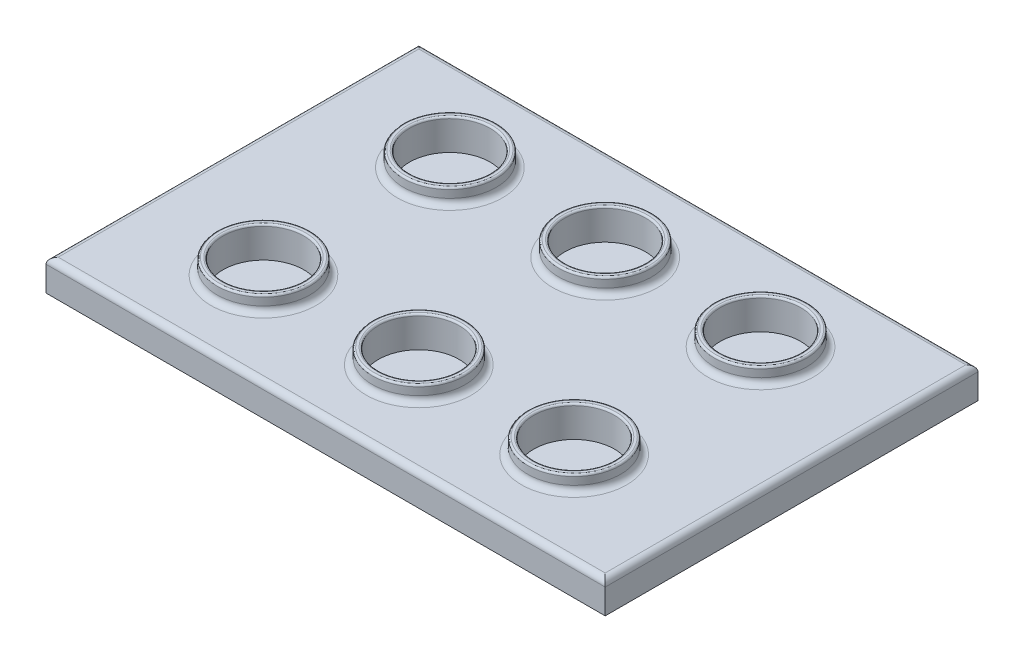
ISO-10303-21;
HEADER;
FILE_DESCRIPTION(('STEP AP214'),'2;1');
FILE_NAME('part.step','',(''),(''),'','','');
FILE_SCHEMA(('AUTOMOTIVE_DESIGN { 1 0 10303 214 1 1 1 1 }'));
ENDSEC;
DATA;
#1=APPLICATION_CONTEXT('core data for automotive mechanical design processes');
#2=APPLICATION_PROTOCOL_DEFINITION('international standard','automotive_design',2000,#1);
#3=PRODUCT_CONTEXT('',#1,'mechanical');
#4=PRODUCT('Part','Part','',(#3));
#5=PRODUCT_RELATED_PRODUCT_CATEGORY('part','',(#4));
#6=PRODUCT_DEFINITION_FORMATION('','',#4);
#7=PRODUCT_DEFINITION_CONTEXT('part definition',#1,'design');
#8=PRODUCT_DEFINITION('design','',#6,#7);
#9=PRODUCT_DEFINITION_SHAPE('','',#8);
#10=(LENGTH_UNIT() NAMED_UNIT(*) SI_UNIT(.MILLI.,.METRE.));
#11=(NAMED_UNIT(*) PLANE_ANGLE_UNIT() SI_UNIT($,.RADIAN.));
#12=(NAMED_UNIT(*) SI_UNIT($,.STERADIAN.) SOLID_ANGLE_UNIT());
#13=UNCERTAINTY_MEASURE_WITH_UNIT(LENGTH_MEASURE(1.E-05),#10,'distance_accuracy_value','');
#14=(GEOMETRIC_REPRESENTATION_CONTEXT(3) GLOBAL_UNCERTAINTY_ASSIGNED_CONTEXT((#13)) GLOBAL_UNIT_ASSIGNED_CONTEXT((#10,
#11,#12)) REPRESENTATION_CONTEXT('',''));
#15=CARTESIAN_POINT('',(0.,0.,0.));
#16=DIRECTION('',(0.,0.,1.));
#17=DIRECTION('',(1.,0.,0.));
#18=AXIS2_PLACEMENT_3D('',#15,#16,#17);
#19=CARTESIAN_POINT('',(0.,12.7,0.));
#20=DIRECTION('',(0.,-1.,0.));
#21=DIRECTION('',(0.,0.,-1.));
#22=AXIS2_PLACEMENT_3D('',#19,#20,#21);
#23=PLANE('',#22);
#24=CARTESIAN_POINT('',(-63.4999999999999,12.7,38.1));
#25=DIRECTION('',(0.,-1.,0.));
#26=DIRECTION('',(0.,0.,-1.));
#27=AXIS2_PLACEMENT_3D('',#24,#25,#26);
#28=CIRCLE('',#27,21.51);
#29=CARTESIAN_POINT('',(-63.4999999999999,12.7,16.59));
#30=VERTEX_POINT('',#29);
#31=EDGE_CURVE('E277',#30,#30,#28,.T.);
#32=ORIENTED_EDGE('',*,*,#31,.T.);
#33=EDGE_LOOP('',(#32));
#34=FACE_BOUND('',#33,.T.);
#35=CARTESIAN_POINT('',(63.5000000000001,12.7,38.1));
#36=DIRECTION('',(0.,-1.,0.));
#37=DIRECTION('',(0.,0.,-1.));
#38=AXIS2_PLACEMENT_3D('',#35,#36,#37);
#39=CIRCLE('',#38,21.51);
#40=CARTESIAN_POINT('',(63.5000000000001,12.7,16.59));
#41=VERTEX_POINT('',#40);
#42=EDGE_CURVE('E273',#41,#41,#39,.T.);
#43=ORIENTED_EDGE('',*,*,#42,.T.);
#44=EDGE_LOOP('',(#43));
#45=FACE_BOUND('',#44,.T.);
#46=CARTESIAN_POINT('',(0.,12.7,-38.1));
#47=DIRECTION('',(0.,-1.,0.));
#48=DIRECTION('',(0.,0.,-1.));
#49=AXIS2_PLACEMENT_3D('',#46,#47,#48);
#50=CIRCLE('',#49,21.51);
#51=CARTESIAN_POINT('',(0.,12.7,-59.61));
#52=VERTEX_POINT('',#51);
#53=EDGE_CURVE('E269',#52,#52,#50,.T.);
#54=ORIENTED_EDGE('',*,*,#53,.T.);
#55=EDGE_LOOP('',(#54));
#56=FACE_BOUND('',#55,.T.);
#57=DIRECTION('',(0.,0.,1.));
#58=VECTOR('',#57,1.);
#59=CARTESIAN_POINT('',(-111.8,12.7,0.));
#60=LINE('',#59,#58);
#61=CARTESIAN_POINT('',(-111.8,12.7,-73.7));
#62=VERTEX_POINT('',#61);
#63=CARTESIAN_POINT('',(-111.8,12.7,73.7));
#64=VERTEX_POINT('',#63);
#65=EDGE_CURVE('E262',#62,#64,#60,.T.);
#66=ORIENTED_EDGE('',*,*,#65,.T.);
#67=DIRECTION('',(1.,0.,0.));
#68=VECTOR('',#67,1.);
#69=CARTESIAN_POINT('',(0.,12.7,73.7));
#70=LINE('',#69,#68);
#71=CARTESIAN_POINT('',(111.8,12.7,73.7));
#72=VERTEX_POINT('',#71);
#73=EDGE_CURVE('E265',#64,#72,#70,.T.);
#74=ORIENTED_EDGE('',*,*,#73,.T.);
#75=DIRECTION('',(0.,0.,-1.));
#76=VECTOR('',#75,1.);
#77=CARTESIAN_POINT('',(111.8,12.7,0.));
#78=LINE('',#77,#76);
#79=CARTESIAN_POINT('',(111.8,12.7,-73.7));
#80=VERTEX_POINT('',#79);
#81=EDGE_CURVE('E256',#72,#80,#78,.T.);
#82=ORIENTED_EDGE('',*,*,#81,.T.);
#83=DIRECTION('',(-1.,0.,0.));
#84=VECTOR('',#83,1.);
#85=CARTESIAN_POINT('',(0.,12.7,-73.7));
#86=LINE('',#85,#84);
#87=EDGE_CURVE('E259',#80,#62,#86,.T.);
#88=ORIENTED_EDGE('',*,*,#87,.T.);
#89=EDGE_LOOP('',(#66,#74,#82,#88));
#90=FACE_BOUND('',#89,.T.);
#91=CARTESIAN_POINT('',(-63.4999999999999,12.7,-38.1));
#92=DIRECTION('',(0.,-1.,0.));
#93=DIRECTION('',(0.,0.,-1.));
#94=AXIS2_PLACEMENT_3D('',#91,#92,#93);
#95=CIRCLE('',#94,21.51);
#96=CARTESIAN_POINT('',(-63.4999999999999,12.7,-59.61));
#97=VERTEX_POINT('',#96);
#98=EDGE_CURVE('E252',#97,#97,#95,.T.);
#99=ORIENTED_EDGE('',*,*,#98,.T.);
#100=EDGE_LOOP('',(#99));
#101=FACE_BOUND('',#100,.T.);
#102=CARTESIAN_POINT('',(63.5000000000001,12.7,-38.1));
#103=DIRECTION('',(0.,-1.,0.));
#104=DIRECTION('',(0.,0.,-1.));
#105=AXIS2_PLACEMENT_3D('',#102,#103,#104);
#106=CIRCLE('',#105,21.51);
#107=CARTESIAN_POINT('',(63.5000000000001,12.7,-59.61));
#108=VERTEX_POINT('',#107);
#109=EDGE_CURVE('E248',#108,#108,#106,.T.);
#110=ORIENTED_EDGE('',*,*,#109,.T.);
#111=EDGE_LOOP('',(#110));
#112=FACE_BOUND('',#111,.T.);
#113=CARTESIAN_POINT('',(0.,12.7,38.1));
#114=DIRECTION('',(0.,-1.,0.));
#115=DIRECTION('',(0.,0.,-1.));
#116=AXIS2_PLACEMENT_3D('',#113,#114,#115);
#117=CIRCLE('',#116,21.51);
#118=CARTESIAN_POINT('',(0.,12.7,16.59));
#119=VERTEX_POINT('',#118);
#120=EDGE_CURVE('E244',#119,#119,#117,.T.);
#121=ORIENTED_EDGE('',*,*,#120,.T.);
#122=EDGE_LOOP('',(#121));
#123=FACE_BOUND('',#122,.T.);
#124=ADVANCED_FACE('F44',(#34,#45,#56,#90,#101,#112,#123),#23,.F.);
#125=CARTESIAN_POINT('',(114.3,12.7,76.2));
#126=DIRECTION('',(-1.,0.,0.));
#127=DIRECTION('',(0.,0.,1.));
#128=AXIS2_PLACEMENT_3D('',#125,#126,#127);
#129=PLANE('',#128);
#130=DIRECTION('',(0.,-1.,0.));
#131=VECTOR('',#130,1.);
#132=CARTESIAN_POINT('',(114.3,12.7,-76.2));
#133=LINE('',#132,#131);
#134=CARTESIAN_POINT('',(114.3,10.2,-76.2));
#135=VERTEX_POINT('',#134);
#136=CARTESIAN_POINT('',(114.3,0.,-76.2));
#137=VERTEX_POINT('',#136);
#138=EDGE_CURVE('E99',#135,#137,#133,.T.);
#139=ORIENTED_EDGE('',*,*,#138,.F.);
#140=DIRECTION('',(0.,0.,-1.));
#141=VECTOR('',#140,1.);
#142=CARTESIAN_POINT('',(114.3,10.2,76.2));
#143=LINE('',#142,#141);
#144=CARTESIAN_POINT('',(114.3,10.2,76.2));
#145=VERTEX_POINT('',#144);
#146=EDGE_CURVE('E297',#135,#145,#143,.F.);
#147=ORIENTED_EDGE('',*,*,#146,.T.);
#148=DIRECTION('',(0.,-1.,0.));
#149=VECTOR('',#148,1.);
#150=CARTESIAN_POINT('',(114.3,12.7,76.2));
#151=LINE('',#150,#149);
#152=CARTESIAN_POINT('',(114.3,0.,76.2));
#153=VERTEX_POINT('',#152);
#154=EDGE_CURVE('E122',#145,#153,#151,.T.);
#155=ORIENTED_EDGE('',*,*,#154,.T.);
#156=DIRECTION('',(0.,0.,-1.));
#157=VECTOR('',#156,1.);
#158=CARTESIAN_POINT('',(114.3,0.,76.2));
#159=LINE('',#158,#157);
#160=EDGE_CURVE('E115',#153,#137,#159,.T.);
#161=ORIENTED_EDGE('',*,*,#160,.T.);
#162=EDGE_LOOP('',(#139,#147,#155,#161));
#163=FACE_BOUND('',#162,.T.);
#164=ADVANCED_FACE('F120',(#163),#129,.F.);
#165=CARTESIAN_POINT('',(-114.3,12.7,-76.2));
#166=DIRECTION('',(0.,0.,1.));
#167=DIRECTION('',(1.,0.,0.));
#168=AXIS2_PLACEMENT_3D('',#165,#166,#167);
#169=PLANE('',#168);
#170=DIRECTION('',(0.,-1.,0.));
#171=VECTOR('',#170,1.);
#172=CARTESIAN_POINT('',(-114.3,12.7,-76.2));
#173=LINE('',#172,#171);
#174=CARTESIAN_POINT('',(-114.3,10.2,-76.2));
#175=VERTEX_POINT('',#174);
#176=CARTESIAN_POINT('',(-114.3,0.,-76.2));
#177=VERTEX_POINT('',#176);
#178=EDGE_CURVE('E109',#175,#177,#173,.T.);
#179=ORIENTED_EDGE('',*,*,#178,.F.);
#180=DIRECTION('',(-1.,0.,0.));
#181=VECTOR('',#180,1.);
#182=CARTESIAN_POINT('',(-114.3,10.2,-76.2));
#183=LINE('',#182,#181);
#184=EDGE_CURVE('E62',#175,#135,#183,.F.);
#185=ORIENTED_EDGE('',*,*,#184,.T.);
#186=ORIENTED_EDGE('',*,*,#138,.T.);
#187=DIRECTION('',(-1.,0.,0.));
#188=VECTOR('',#187,1.);
#189=CARTESIAN_POINT('',(-114.3,0.,-76.2));
#190=LINE('',#189,#188);
#191=EDGE_CURVE('E102',#137,#177,#190,.T.);
#192=ORIENTED_EDGE('',*,*,#191,.T.);
#193=EDGE_LOOP('',(#179,#185,#186,#192));
#194=FACE_BOUND('',#193,.T.);
#195=ADVANCED_FACE('F101',(#194),#169,.F.);
#196=CARTESIAN_POINT('',(-114.3,12.7,76.2));
#197=DIRECTION('',(1.,0.,0.));
#198=DIRECTION('',(0.,0.,-1.));
#199=AXIS2_PLACEMENT_3D('',#196,#197,#198);
#200=PLANE('',#199);
#201=DIRECTION('',(0.,-1.,0.));
#202=VECTOR('',#201,1.);
#203=CARTESIAN_POINT('',(-114.3,12.7,76.2));
#204=LINE('',#203,#202);
#205=CARTESIAN_POINT('',(-114.3,10.2,76.2));
#206=VERTEX_POINT('',#205);
#207=CARTESIAN_POINT('',(-114.3,0.,76.2));
#208=VERTEX_POINT('',#207);
#209=EDGE_CURVE('E140',#206,#208,#204,.T.);
#210=ORIENTED_EDGE('',*,*,#209,.F.);
#211=DIRECTION('',(0.,0.,1.));
#212=VECTOR('',#211,1.);
#213=CARTESIAN_POINT('',(-114.3,10.2,76.2));
#214=LINE('',#213,#212);
#215=EDGE_CURVE('E70',#206,#175,#214,.F.);
#216=ORIENTED_EDGE('',*,*,#215,.T.);
#217=ORIENTED_EDGE('',*,*,#178,.T.);
#218=DIRECTION('',(0.,0.,1.));
#219=VECTOR('',#218,1.);
#220=CARTESIAN_POINT('',(-114.3,0.,76.2));
#221=LINE('',#220,#219);
#222=EDGE_CURVE('E117',#177,#208,#221,.T.);
#223=ORIENTED_EDGE('',*,*,#222,.T.);
#224=EDGE_LOOP('',(#210,#216,#217,#223));
#225=FACE_BOUND('',#224,.T.);
#226=ADVANCED_FACE('F381',(#225),#200,.F.);
#227=CARTESIAN_POINT('',(-114.3,12.7,76.2));
#228=DIRECTION('',(0.,0.,-1.));
#229=DIRECTION('',(-1.,0.,0.));
#230=AXIS2_PLACEMENT_3D('',#227,#228,#229);
#231=PLANE('',#230);
#232=ORIENTED_EDGE('',*,*,#154,.F.);
#233=DIRECTION('',(1.,0.,0.));
#234=VECTOR('',#233,1.);
#235=CARTESIAN_POINT('',(-114.3,10.2,76.2));
#236=LINE('',#235,#234);
#237=EDGE_CURVE('E289',#145,#206,#236,.F.);
#238=ORIENTED_EDGE('',*,*,#237,.T.);
#239=ORIENTED_EDGE('',*,*,#209,.T.);
#240=DIRECTION('',(1.,0.,0.));
#241=VECTOR('',#240,1.);
#242=CARTESIAN_POINT('',(-114.3,0.,76.2));
#243=LINE('',#242,#241);
#244=EDGE_CURVE('E135',#208,#153,#243,.T.);
#245=ORIENTED_EDGE('',*,*,#244,.T.);
#246=EDGE_LOOP('',(#232,#238,#239,#245));
#247=FACE_BOUND('',#246,.T.);
#248=ADVANCED_FACE('F378',(#247),#231,.F.);
#249=CARTESIAN_POINT('',(0.,0.,0.));
#250=DIRECTION('',(0.,-1.,0.));
#251=DIRECTION('',(0.,0.,-1.));
#252=AXIS2_PLACEMENT_3D('',#249,#250,#251);
#253=PLANE('',#252);
#254=ORIENTED_EDGE('',*,*,#160,.F.);
#255=ORIENTED_EDGE('',*,*,#244,.F.);
#256=ORIENTED_EDGE('',*,*,#222,.F.);
#257=ORIENTED_EDGE('',*,*,#191,.F.);
#258=EDGE_LOOP('',(#254,#255,#256,#257));
#259=FACE_BOUND('',#258,.T.);
#260=ADVANCED_FACE('F113',(#259),#253,.T.);
#261=CARTESIAN_POINT('',(-63.4999999999999,19.05,-38.1));
#262=DIRECTION('',(0.,1.,0.));
#263=DIRECTION('',(0.,0.,1.));
#264=AXIS2_PLACEMENT_3D('',#261,#262,#263);
#265=PLANE('',#264);
#266=CARTESIAN_POINT('',(-63.4999999999999,19.05,-38.1));
#267=DIRECTION('',(0.,1.,0.));
#268=DIRECTION('',(0.,0.,1.));
#269=AXIS2_PLACEMENT_3D('',#266,#267,#268);
#270=CIRCLE('',#269,17.26);
#271=CARTESIAN_POINT('',(-63.4999999999999,19.05,-20.84));
#272=VERTEX_POINT('',#271);
#273=EDGE_CURVE('E152',#272,#272,#270,.F.);
#274=ORIENTED_EDGE('',*,*,#273,.T.);
#275=EDGE_LOOP('',(#274));
#276=FACE_BOUND('',#275,.T.);
#277=CARTESIAN_POINT('',(-63.4999999999999,19.05,-38.1));
#278=DIRECTION('',(0.,1.,0.));
#279=DIRECTION('',(0.,0.,1.));
#280=AXIS2_PLACEMENT_3D('',#277,#278,#279);
#281=CIRCLE('',#280,18.26);
#282=CARTESIAN_POINT('',(-63.4999999999999,19.05,-19.84));
#283=VERTEX_POINT('',#282);
#284=EDGE_CURVE('E148',#283,#283,#281,.T.);
#285=ORIENTED_EDGE('',*,*,#284,.T.);
#286=EDGE_LOOP('',(#285));
#287=FACE_BOUND('',#286,.T.);
#288=ADVANCED_FACE('F377',(#276,#287),#265,.T.);
#289=CARTESIAN_POINT('',(-63.4999999999999,19.05,-38.1));
#290=DIRECTION('',(0.,-1.,0.));
#291=DIRECTION('',(0.,0.,-1.));
#292=AXIS2_PLACEMENT_3D('',#289,#290,#291);
#293=CYLINDRICAL_SURFACE('',#292,19.01);
#294=CARTESIAN_POINT('',(-63.4999999999999,15.2,-38.1));
#295=DIRECTION('',(0.,-1.,0.));
#296=DIRECTION('',(0.,0.,-1.));
#297=AXIS2_PLACEMENT_3D('',#294,#295,#296);
#298=CIRCLE('',#297,19.01);
#299=CARTESIAN_POINT('',(-63.4999999999999,15.2,-57.11));
#300=VERTEX_POINT('',#299);
#301=EDGE_CURVE('E300',#300,#300,#298,.F.);
#302=ORIENTED_EDGE('',*,*,#301,.T.);
#303=EDGE_LOOP('',(#302));
#304=FACE_BOUND('',#303,.T.);
#305=CARTESIAN_POINT('',(-63.4999999999999,18.3,-38.1));
#306=DIRECTION('',(0.,1.,0.));
#307=DIRECTION('',(0.,0.,1.));
#308=AXIS2_PLACEMENT_3D('',#305,#306,#307);
#309=CIRCLE('',#308,19.01);
#310=CARTESIAN_POINT('',(-63.4999999999999,18.3,-19.09));
#311=VERTEX_POINT('',#310);
#312=EDGE_CURVE('E156',#311,#311,#309,.F.);
#313=ORIENTED_EDGE('',*,*,#312,.T.);
#314=EDGE_LOOP('',(#313));
#315=FACE_BOUND('',#314,.T.);
#316=ADVANCED_FACE('F485',(#304,#315),#293,.T.);
#317=CARTESIAN_POINT('',(63.5000000000001,19.05,-38.1));
#318=DIRECTION('',(0.,1.,0.));
#319=DIRECTION('',(0.,0.,1.));
#320=AXIS2_PLACEMENT_3D('',#317,#318,#319);
#321=PLANE('',#320);
#322=CARTESIAN_POINT('',(63.5000000000001,19.05,-38.1));
#323=DIRECTION('',(0.,1.,0.));
#324=DIRECTION('',(0.,0.,1.));
#325=AXIS2_PLACEMENT_3D('',#322,#323,#324);
#326=CIRCLE('',#325,17.26);
#327=CARTESIAN_POINT('',(63.5000000000001,19.05,-20.84));
#328=VERTEX_POINT('',#327);
#329=EDGE_CURVE('E184',#328,#328,#326,.F.);
#330=ORIENTED_EDGE('',*,*,#329,.T.);
#331=EDGE_LOOP('',(#330));
#332=FACE_BOUND('',#331,.T.);
#333=CARTESIAN_POINT('',(63.5000000000001,19.05,-38.1));
#334=DIRECTION('',(0.,1.,0.));
#335=DIRECTION('',(0.,0.,1.));
#336=AXIS2_PLACEMENT_3D('',#333,#334,#335);
#337=CIRCLE('',#336,18.26);
#338=CARTESIAN_POINT('',(63.5000000000001,19.05,-19.84));
#339=VERTEX_POINT('',#338);
#340=EDGE_CURVE('E180',#339,#339,#337,.T.);
#341=ORIENTED_EDGE('',*,*,#340,.T.);
#342=EDGE_LOOP('',(#341));
#343=FACE_BOUND('',#342,.T.);
#344=ADVANCED_FACE('F478',(#332,#343),#321,.T.);
#345=CARTESIAN_POINT('',(63.5000000000001,19.05,-38.1));
#346=DIRECTION('',(0.,-1.,0.));
#347=DIRECTION('',(0.,0.,-1.));
#348=AXIS2_PLACEMENT_3D('',#345,#346,#347);
#349=CYLINDRICAL_SURFACE('',#348,19.01);
#350=CARTESIAN_POINT('',(63.5000000000001,15.2,-38.1));
#351=DIRECTION('',(0.,-1.,0.));
#352=DIRECTION('',(0.,0.,-1.));
#353=AXIS2_PLACEMENT_3D('',#350,#351,#352);
#354=CIRCLE('',#353,19.01);
#355=CARTESIAN_POINT('',(63.5000000000001,15.2,-57.11));
#356=VERTEX_POINT('',#355);
#357=EDGE_CURVE('E54',#356,#356,#354,.F.);
#358=ORIENTED_EDGE('',*,*,#357,.T.);
#359=EDGE_LOOP('',(#358));
#360=FACE_BOUND('',#359,.T.);
#361=CARTESIAN_POINT('',(63.5000000000001,18.3,-38.1));
#362=DIRECTION('',(0.,1.,0.));
#363=DIRECTION('',(0.,0.,1.));
#364=AXIS2_PLACEMENT_3D('',#361,#362,#363);
#365=CIRCLE('',#364,19.01);
#366=CARTESIAN_POINT('',(63.5000000000001,18.3,-19.09));
#367=VERTEX_POINT('',#366);
#368=EDGE_CURVE('E188',#367,#367,#365,.F.);
#369=ORIENTED_EDGE('',*,*,#368,.T.);
#370=EDGE_LOOP('',(#369));
#371=FACE_BOUND('',#370,.T.);
#372=ADVANCED_FACE('F474',(#360,#371),#349,.T.);
#373=CARTESIAN_POINT('',(0.,19.05,-38.1));
#374=DIRECTION('',(0.,1.,0.));
#375=DIRECTION('',(0.,0.,1.));
#376=AXIS2_PLACEMENT_3D('',#373,#374,#375);
#377=PLANE('',#376);
#378=CARTESIAN_POINT('',(0.,19.05,-38.1));
#379=DIRECTION('',(0.,1.,0.));
#380=DIRECTION('',(0.,0.,1.));
#381=AXIS2_PLACEMENT_3D('',#378,#379,#380);
#382=CIRCLE('',#381,17.26);
#383=CARTESIAN_POINT('',(0.,19.05,-20.84));
#384=VERTEX_POINT('',#383);
#385=EDGE_CURVE('E168',#384,#384,#382,.F.);
#386=ORIENTED_EDGE('',*,*,#385,.T.);
#387=EDGE_LOOP('',(#386));
#388=FACE_BOUND('',#387,.T.);
#389=CARTESIAN_POINT('',(0.,19.05,-38.1));
#390=DIRECTION('',(0.,1.,0.));
#391=DIRECTION('',(0.,0.,1.));
#392=AXIS2_PLACEMENT_3D('',#389,#390,#391);
#393=CIRCLE('',#392,18.26);
#394=CARTESIAN_POINT('',(0.,19.05,-19.84));
#395=VERTEX_POINT('',#394);
#396=EDGE_CURVE('E164',#395,#395,#393,.T.);
#397=ORIENTED_EDGE('',*,*,#396,.T.);
#398=EDGE_LOOP('',(#397));
#399=FACE_BOUND('',#398,.T.);
#400=ADVANCED_FACE('F477',(#388,#399),#377,.T.);
#401=CARTESIAN_POINT('',(0.,19.05,-38.1));
#402=DIRECTION('',(0.,-1.,0.));
#403=DIRECTION('',(0.,0.,-1.));
#404=AXIS2_PLACEMENT_3D('',#401,#402,#403);
#405=CYLINDRICAL_SURFACE('',#404,19.01);
#406=CARTESIAN_POINT('',(0.,15.2,-38.1));
#407=DIRECTION('',(0.,-1.,0.));
#408=DIRECTION('',(0.,0.,-1.));
#409=AXIS2_PLACEMENT_3D('',#406,#407,#408);
#410=CIRCLE('',#409,19.01);
#411=CARTESIAN_POINT('',(0.,15.2,-57.11));
#412=VERTEX_POINT('',#411);
#413=EDGE_CURVE('E285',#412,#412,#410,.F.);
#414=ORIENTED_EDGE('',*,*,#413,.T.);
#415=EDGE_LOOP('',(#414));
#416=FACE_BOUND('',#415,.T.);
#417=CARTESIAN_POINT('',(0.,18.3,-38.1));
#418=DIRECTION('',(0.,1.,0.));
#419=DIRECTION('',(0.,0.,1.));
#420=AXIS2_PLACEMENT_3D('',#417,#418,#419);
#421=CIRCLE('',#420,19.01);
#422=CARTESIAN_POINT('',(0.,18.3,-19.09));
#423=VERTEX_POINT('',#422);
#424=EDGE_CURVE('E172',#423,#423,#421,.F.);
#425=ORIENTED_EDGE('',*,*,#424,.T.);
#426=EDGE_LOOP('',(#425));
#427=FACE_BOUND('',#426,.T.);
#428=ADVANCED_FACE('F504',(#416,#427),#405,.T.);
#429=CARTESIAN_POINT('',(63.5000000000001,19.05,38.1));
#430=DIRECTION('',(0.,1.,0.));
#431=DIRECTION('',(0.,0.,1.));
#432=AXIS2_PLACEMENT_3D('',#429,#430,#431);
#433=PLANE('',#432);
#434=CARTESIAN_POINT('',(63.5000000000001,19.05,38.1));
#435=DIRECTION('',(0.,1.,0.));
#436=DIRECTION('',(0.,0.,1.));
#437=AXIS2_PLACEMENT_3D('',#434,#435,#436);
#438=CIRCLE('',#437,17.26);
#439=CARTESIAN_POINT('',(63.5000000000001,19.05,55.36));
#440=VERTEX_POINT('',#439);
#441=EDGE_CURVE('E200',#440,#440,#438,.F.);
#442=ORIENTED_EDGE('',*,*,#441,.T.);
#443=EDGE_LOOP('',(#442));
#444=FACE_BOUND('',#443,.T.);
#445=CARTESIAN_POINT('',(63.5000000000001,19.05,38.1));
#446=DIRECTION('',(0.,1.,0.));
#447=DIRECTION('',(0.,0.,1.));
#448=AXIS2_PLACEMENT_3D('',#445,#446,#447);
#449=CIRCLE('',#448,18.26);
#450=CARTESIAN_POINT('',(63.5000000000001,19.05,56.36));
#451=VERTEX_POINT('',#450);
#452=EDGE_CURVE('E196',#451,#451,#449,.T.);
#453=ORIENTED_EDGE('',*,*,#452,.T.);
#454=EDGE_LOOP('',(#453));
#455=FACE_BOUND('',#454,.T.);
#456=ADVANCED_FACE('F500',(#444,#455),#433,.T.);
#457=CARTESIAN_POINT('',(63.5000000000001,19.05,38.1));
#458=DIRECTION('',(0.,-1.,0.));
#459=DIRECTION('',(0.,0.,-1.));
#460=AXIS2_PLACEMENT_3D('',#457,#458,#459);
#461=CYLINDRICAL_SURFACE('',#460,19.01);
#462=CARTESIAN_POINT('',(63.5000000000001,15.2,38.1));
#463=DIRECTION('',(0.,-1.,0.));
#464=DIRECTION('',(0.,0.,-1.));
#465=AXIS2_PLACEMENT_3D('',#462,#463,#464);
#466=CIRCLE('',#465,19.01);
#467=CARTESIAN_POINT('',(63.5000000000001,15.2,19.09));
#468=VERTEX_POINT('',#467);
#469=EDGE_CURVE('E281',#468,#468,#466,.F.);
#470=ORIENTED_EDGE('',*,*,#469,.T.);
#471=EDGE_LOOP('',(#470));
#472=FACE_BOUND('',#471,.T.);
#473=CARTESIAN_POINT('',(63.5000000000001,18.3,38.1));
#474=DIRECTION('',(0.,1.,0.));
#475=DIRECTION('',(0.,0.,1.));
#476=AXIS2_PLACEMENT_3D('',#473,#474,#475);
#477=CIRCLE('',#476,19.01);
#478=CARTESIAN_POINT('',(63.5000000000001,18.3,57.11));
#479=VERTEX_POINT('',#478);
#480=EDGE_CURVE('E204',#479,#479,#477,.F.);
#481=ORIENTED_EDGE('',*,*,#480,.T.);
#482=EDGE_LOOP('',(#481));
#483=FACE_BOUND('',#482,.T.);
#484=ADVANCED_FACE('F496',(#472,#483),#461,.T.);
#485=CARTESIAN_POINT('',(0.,19.05,38.1));
#486=DIRECTION('',(0.,1.,0.));
#487=DIRECTION('',(0.,0.,1.));
#488=AXIS2_PLACEMENT_3D('',#485,#486,#487);
#489=PLANE('',#488);
#490=CARTESIAN_POINT('',(0.,19.05,38.1));
#491=DIRECTION('',(0.,1.,0.));
#492=DIRECTION('',(0.,0.,1.));
#493=AXIS2_PLACEMENT_3D('',#490,#491,#492);
#494=CIRCLE('',#493,17.26);
#495=CARTESIAN_POINT('',(0.,19.05,55.36));
#496=VERTEX_POINT('',#495);
#497=EDGE_CURVE('E216',#496,#496,#494,.F.);
#498=ORIENTED_EDGE('',*,*,#497,.T.);
#499=EDGE_LOOP('',(#498));
#500=FACE_BOUND('',#499,.T.);
#501=CARTESIAN_POINT('',(0.,19.05,38.1));
#502=DIRECTION('',(0.,1.,0.));
#503=DIRECTION('',(0.,0.,1.));
#504=AXIS2_PLACEMENT_3D('',#501,#502,#503);
#505=CIRCLE('',#504,18.26);
#506=CARTESIAN_POINT('',(0.,19.05,56.36));
#507=VERTEX_POINT('',#506);
#508=EDGE_CURVE('E212',#507,#507,#505,.T.);
#509=ORIENTED_EDGE('',*,*,#508,.T.);
#510=EDGE_LOOP('',(#509));
#511=FACE_BOUND('',#510,.T.);
#512=ADVANCED_FACE('F499',(#500,#511),#489,.T.);
#513=CARTESIAN_POINT('',(0.,19.05,38.1));
#514=DIRECTION('',(0.,-1.,0.));
#515=DIRECTION('',(0.,0.,-1.));
#516=AXIS2_PLACEMENT_3D('',#513,#514,#515);
#517=CYLINDRICAL_SURFACE('',#516,19.01);
#518=CARTESIAN_POINT('',(0.,15.2,38.1));
#519=DIRECTION('',(0.,-1.,0.));
#520=DIRECTION('',(0.,0.,-1.));
#521=AXIS2_PLACEMENT_3D('',#518,#519,#520);
#522=CIRCLE('',#521,19.01);
#523=CARTESIAN_POINT('',(0.,15.2,19.09));
#524=VERTEX_POINT('',#523);
#525=EDGE_CURVE('E11',#524,#524,#522,.F.);
#526=ORIENTED_EDGE('',*,*,#525,.T.);
#527=EDGE_LOOP('',(#526));
#528=FACE_BOUND('',#527,.T.);
#529=CARTESIAN_POINT('',(0.,18.3,38.1));
#530=DIRECTION('',(0.,1.,0.));
#531=DIRECTION('',(0.,0.,1.));
#532=AXIS2_PLACEMENT_3D('',#529,#530,#531);
#533=CIRCLE('',#532,19.01);
#534=CARTESIAN_POINT('',(0.,18.3,57.11));
#535=VERTEX_POINT('',#534);
#536=EDGE_CURVE('E220',#535,#535,#533,.F.);
#537=ORIENTED_EDGE('',*,*,#536,.T.);
#538=EDGE_LOOP('',(#537));
#539=FACE_BOUND('',#538,.T.);
#540=ADVANCED_FACE('F506',(#528,#539),#517,.T.);
#541=CARTESIAN_POINT('',(-63.4999999999999,19.05,38.1));
#542=DIRECTION('',(0.,1.,0.));
#543=DIRECTION('',(0.,0.,1.));
#544=AXIS2_PLACEMENT_3D('',#541,#542,#543);
#545=PLANE('',#544);
#546=CARTESIAN_POINT('',(-63.4999999999999,19.05,38.1));
#547=DIRECTION('',(0.,1.,0.));
#548=DIRECTION('',(0.,0.,1.));
#549=AXIS2_PLACEMENT_3D('',#546,#547,#548);
#550=CIRCLE('',#549,17.26);
#551=CARTESIAN_POINT('',(-63.4999999999999,19.05,55.36));
#552=VERTEX_POINT('',#551);
#553=EDGE_CURVE('E232',#552,#552,#550,.F.);
#554=ORIENTED_EDGE('',*,*,#553,.T.);
#555=EDGE_LOOP('',(#554));
#556=FACE_BOUND('',#555,.T.);
#557=CARTESIAN_POINT('',(-63.4999999999999,19.05,38.1));
#558=DIRECTION('',(0.,1.,0.));
#559=DIRECTION('',(0.,0.,1.));
#560=AXIS2_PLACEMENT_3D('',#557,#558,#559);
#561=CIRCLE('',#560,18.26);
#562=CARTESIAN_POINT('',(-63.4999999999999,19.05,56.36));
#563=VERTEX_POINT('',#562);
#564=EDGE_CURVE('E228',#563,#563,#561,.T.);
#565=ORIENTED_EDGE('',*,*,#564,.T.);
#566=EDGE_LOOP('',(#565));
#567=FACE_BOUND('',#566,.T.);
#568=ADVANCED_FACE('F509',(#556,#567),#545,.T.);
#569=CARTESIAN_POINT('',(-63.4999999999999,19.05,38.1));
#570=DIRECTION('',(0.,-1.,0.));
#571=DIRECTION('',(0.,0.,-1.));
#572=AXIS2_PLACEMENT_3D('',#569,#570,#571);
#573=CYLINDRICAL_SURFACE('',#572,19.01);
#574=CARTESIAN_POINT('',(-63.4999999999999,15.2,38.1));
#575=DIRECTION('',(0.,-1.,0.));
#576=DIRECTION('',(0.,0.,-1.));
#577=AXIS2_PLACEMENT_3D('',#574,#575,#576);
#578=CIRCLE('',#577,19.01);
#579=CARTESIAN_POINT('',(-63.4999999999999,15.2,19.09));
#580=VERTEX_POINT('',#579);
#581=EDGE_CURVE('E240',#580,#580,#578,.F.);
#582=ORIENTED_EDGE('',*,*,#581,.T.);
#583=EDGE_LOOP('',(#582));
#584=FACE_BOUND('',#583,.T.);
#585=CARTESIAN_POINT('',(-63.4999999999999,18.3,38.1));
#586=DIRECTION('',(0.,1.,0.));
#587=DIRECTION('',(0.,0.,1.));
#588=AXIS2_PLACEMENT_3D('',#585,#586,#587);
#589=CIRCLE('',#588,19.01);
#590=CARTESIAN_POINT('',(-63.4999999999999,18.3,57.11));
#591=VERTEX_POINT('',#590);
#592=EDGE_CURVE('E236',#591,#591,#589,.F.);
#593=ORIENTED_EDGE('',*,*,#592,.T.);
#594=EDGE_LOOP('',(#593));
#595=FACE_BOUND('',#594,.T.);
#596=ADVANCED_FACE('F514',(#584,#595),#573,.T.);
#597=CARTESIAN_POINT('',(-63.4999999999999,6.35,-38.1));
#598=DIRECTION('',(0.,1.,0.));
#599=DIRECTION('',(0.,0.,1.));
#600=AXIS2_PLACEMENT_3D('',#597,#598,#599);
#601=PLANE('',#600);
#602=CARTESIAN_POINT('',(-63.4999999999999,6.35,-38.1));
#603=DIRECTION('',(0.,1.,0.));
#604=DIRECTION('',(0.,0.,1.));
#605=AXIS2_PLACEMENT_3D('',#602,#603,#604);
#606=CIRCLE('',#605,16.51);
#607=CARTESIAN_POINT('',(-63.4999999999999,6.35,-21.59));
#608=VERTEX_POINT('',#607);
#609=EDGE_CURVE('E320',#608,#608,#606,.T.);
#610=ORIENTED_EDGE('',*,*,#609,.T.);
#611=EDGE_LOOP('',(#610));
#612=FACE_BOUND('',#611,.T.);
#613=ADVANCED_FACE('F517',(#612),#601,.T.);
#614=CARTESIAN_POINT('',(-63.4999999999999,6.35,-38.1));
#615=DIRECTION('',(0.,1.,0.));
#616=DIRECTION('',(0.,0.,1.));
#617=AXIS2_PLACEMENT_3D('',#614,#615,#616);
#618=CYLINDRICAL_SURFACE('',#617,16.51);
#619=CARTESIAN_POINT('',(-63.4999999999999,18.3,-38.1));
#620=DIRECTION('',(0.,1.,0.));
#621=DIRECTION('',(0.,0.,1.));
#622=AXIS2_PLACEMENT_3D('',#619,#620,#621);
#623=CIRCLE('',#622,16.51);
#624=CARTESIAN_POINT('',(-63.4999999999999,18.3,-21.59));
#625=VERTEX_POINT('',#624);
#626=EDGE_CURVE('E108',#625,#625,#623,.T.);
#627=ORIENTED_EDGE('',*,*,#626,.T.);
#628=EDGE_LOOP('',(#627));
#629=FACE_BOUND('',#628,.T.);
#630=ORIENTED_EDGE('',*,*,#609,.F.);
#631=EDGE_LOOP('',(#630));
#632=FACE_BOUND('',#631,.T.);
#633=ADVANCED_FACE('F533',(#629,#632),#618,.F.);
#634=CARTESIAN_POINT('',(63.5000000000001,6.35,-38.1));
#635=DIRECTION('',(0.,1.,0.));
#636=DIRECTION('',(0.,0.,1.));
#637=AXIS2_PLACEMENT_3D('',#634,#635,#636);
#638=PLANE('',#637);
#639=CARTESIAN_POINT('',(63.5000000000001,6.35,-38.1));
#640=DIRECTION('',(0.,1.,0.));
#641=DIRECTION('',(0.,0.,1.));
#642=AXIS2_PLACEMENT_3D('',#639,#640,#641);
#643=CIRCLE('',#642,16.51);
#644=CARTESIAN_POINT('',(63.5000000000001,6.35,-21.59));
#645=VERTEX_POINT('',#644);
#646=EDGE_CURVE('E326',#645,#645,#643,.T.);
#647=ORIENTED_EDGE('',*,*,#646,.T.);
#648=EDGE_LOOP('',(#647));
#649=FACE_BOUND('',#648,.T.);
#650=ADVANCED_FACE('F536',(#649),#638,.T.);
#651=CARTESIAN_POINT('',(63.5000000000001,6.35,-38.1));
#652=DIRECTION('',(0.,1.,0.));
#653=DIRECTION('',(0.,0.,1.));
#654=AXIS2_PLACEMENT_3D('',#651,#652,#653);
#655=CYLINDRICAL_SURFACE('',#654,16.51);
#656=CARTESIAN_POINT('',(63.5000000000001,18.3,-38.1));
#657=DIRECTION('',(0.,1.,0.));
#658=DIRECTION('',(0.,0.,1.));
#659=AXIS2_PLACEMENT_3D('',#656,#657,#658);
#660=CIRCLE('',#659,16.51);
#661=CARTESIAN_POINT('',(63.5000000000001,18.3,-21.59));
#662=VERTEX_POINT('',#661);
#663=EDGE_CURVE('E176',#662,#662,#660,.T.);
#664=ORIENTED_EDGE('',*,*,#663,.T.);
#665=EDGE_LOOP('',(#664));
#666=FACE_BOUND('',#665,.T.);
#667=ORIENTED_EDGE('',*,*,#646,.F.);
#668=EDGE_LOOP('',(#667));
#669=FACE_BOUND('',#668,.T.);
#670=ADVANCED_FACE('F542',(#666,#669),#655,.F.);
#671=CARTESIAN_POINT('',(0.,6.35,-38.1));
#672=DIRECTION('',(0.,1.,0.));
#673=DIRECTION('',(0.,0.,1.));
#674=AXIS2_PLACEMENT_3D('',#671,#672,#673);
#675=PLANE('',#674);
#676=CARTESIAN_POINT('',(0.,6.35,-38.1));
#677=DIRECTION('',(0.,1.,0.));
#678=DIRECTION('',(0.,0.,1.));
#679=AXIS2_PLACEMENT_3D('',#676,#677,#678);
#680=CIRCLE('',#679,16.51);
#681=CARTESIAN_POINT('',(0.,6.35,-21.59));
#682=VERTEX_POINT('',#681);
#683=EDGE_CURVE('E331',#682,#682,#680,.T.);
#684=ORIENTED_EDGE('',*,*,#683,.T.);
#685=EDGE_LOOP('',(#684));
#686=FACE_BOUND('',#685,.T.);
#687=ADVANCED_FACE('F548',(#686),#675,.T.);
#688=CARTESIAN_POINT('',(0.,6.35,-38.1));
#689=DIRECTION('',(0.,1.,0.));
#690=DIRECTION('',(0.,0.,1.));
#691=AXIS2_PLACEMENT_3D('',#688,#689,#690);
#692=CYLINDRICAL_SURFACE('',#691,16.51);
#693=CARTESIAN_POINT('',(0.,18.3,-38.1));
#694=DIRECTION('',(0.,1.,0.));
#695=DIRECTION('',(0.,0.,1.));
#696=AXIS2_PLACEMENT_3D('',#693,#694,#695);
#697=CIRCLE('',#696,16.51);
#698=CARTESIAN_POINT('',(0.,18.3,-21.59));
#699=VERTEX_POINT('',#698);
#700=EDGE_CURVE('E160',#699,#699,#697,.T.);
#701=ORIENTED_EDGE('',*,*,#700,.T.);
#702=EDGE_LOOP('',(#701));
#703=FACE_BOUND('',#702,.T.);
#704=ORIENTED_EDGE('',*,*,#683,.F.);
#705=EDGE_LOOP('',(#704));
#706=FACE_BOUND('',#705,.T.);
#707=ADVANCED_FACE('F552',(#703,#706),#692,.F.);
#708=CARTESIAN_POINT('',(63.5000000000001,6.35,38.1));
#709=DIRECTION('',(0.,1.,0.));
#710=DIRECTION('',(0.,0.,1.));
#711=AXIS2_PLACEMENT_3D('',#708,#709,#710);
#712=PLANE('',#711);
#713=CARTESIAN_POINT('',(63.5000000000001,6.35,38.1));
#714=DIRECTION('',(0.,1.,0.));
#715=DIRECTION('',(0.,0.,1.));
#716=AXIS2_PLACEMENT_3D('',#713,#714,#715);
#717=CIRCLE('',#716,16.51);
#718=CARTESIAN_POINT('',(63.5000000000001,6.35,54.61));
#719=VERTEX_POINT('',#718);
#720=EDGE_CURVE('E337',#719,#719,#717,.T.);
#721=ORIENTED_EDGE('',*,*,#720,.T.);
#722=EDGE_LOOP('',(#721));
#723=FACE_BOUND('',#722,.T.);
#724=ADVANCED_FACE('F556',(#723),#712,.T.);
#725=CARTESIAN_POINT('',(63.5000000000001,6.35,38.1));
#726=DIRECTION('',(0.,1.,0.));
#727=DIRECTION('',(0.,0.,1.));
#728=AXIS2_PLACEMENT_3D('',#725,#726,#727);
#729=CYLINDRICAL_SURFACE('',#728,16.51);
#730=CARTESIAN_POINT('',(63.5000000000001,18.3,38.1));
#731=DIRECTION('',(0.,1.,0.));
#732=DIRECTION('',(0.,0.,1.));
#733=AXIS2_PLACEMENT_3D('',#730,#731,#732);
#734=CIRCLE('',#733,16.51);
#735=CARTESIAN_POINT('',(63.5000000000001,18.3,54.61));
#736=VERTEX_POINT('',#735);
#737=EDGE_CURVE('E192',#736,#736,#734,.T.);
#738=ORIENTED_EDGE('',*,*,#737,.T.);
#739=EDGE_LOOP('',(#738));
#740=FACE_BOUND('',#739,.T.);
#741=ORIENTED_EDGE('',*,*,#720,.F.);
#742=EDGE_LOOP('',(#741));
#743=FACE_BOUND('',#742,.T.);
#744=ADVANCED_FACE('F361',(#740,#743),#729,.F.);
#745=CARTESIAN_POINT('',(0.,6.35,38.1));
#746=DIRECTION('',(0.,1.,0.));
#747=DIRECTION('',(0.,0.,1.));
#748=AXIS2_PLACEMENT_3D('',#745,#746,#747);
#749=PLANE('',#748);
#750=CARTESIAN_POINT('',(0.,6.35,38.1));
#751=DIRECTION('',(0.,1.,0.));
#752=DIRECTION('',(0.,0.,1.));
#753=AXIS2_PLACEMENT_3D('',#750,#751,#752);
#754=CIRCLE('',#753,16.51);
#755=CARTESIAN_POINT('',(0.,6.35,54.61));
#756=VERTEX_POINT('',#755);
#757=EDGE_CURVE('E129',#756,#756,#754,.T.);
#758=ORIENTED_EDGE('',*,*,#757,.T.);
#759=EDGE_LOOP('',(#758));
#760=FACE_BOUND('',#759,.T.);
#761=ADVANCED_FACE('F345',(#760),#749,.T.);
#762=CARTESIAN_POINT('',(0.,6.35,38.1));
#763=DIRECTION('',(0.,1.,0.));
#764=DIRECTION('',(0.,0.,1.));
#765=AXIS2_PLACEMENT_3D('',#762,#763,#764);
#766=CYLINDRICAL_SURFACE('',#765,16.51);
#767=CARTESIAN_POINT('',(0.,18.3,38.1));
#768=DIRECTION('',(0.,1.,0.));
#769=DIRECTION('',(0.,0.,1.));
#770=AXIS2_PLACEMENT_3D('',#767,#768,#769);
#771=CIRCLE('',#770,16.51);
#772=CARTESIAN_POINT('',(0.,18.3,54.61));
#773=VERTEX_POINT('',#772);
#774=EDGE_CURVE('E208',#773,#773,#771,.T.);
#775=ORIENTED_EDGE('',*,*,#774,.T.);
#776=EDGE_LOOP('',(#775));
#777=FACE_BOUND('',#776,.T.);
#778=ORIENTED_EDGE('',*,*,#757,.F.);
#779=EDGE_LOOP('',(#778));
#780=FACE_BOUND('',#779,.T.);
#781=ADVANCED_FACE('F347',(#777,#780),#766,.F.);
#782=CARTESIAN_POINT('',(-63.4999999999999,6.35,38.1));
#783=DIRECTION('',(0.,1.,0.));
#784=DIRECTION('',(0.,0.,1.));
#785=AXIS2_PLACEMENT_3D('',#782,#783,#784);
#786=PLANE('',#785);
#787=CARTESIAN_POINT('',(-63.4999999999999,6.35,38.1));
#788=DIRECTION('',(0.,1.,0.));
#789=DIRECTION('',(0.,0.,1.));
#790=AXIS2_PLACEMENT_3D('',#787,#788,#789);
#791=CIRCLE('',#790,16.51);
#792=CARTESIAN_POINT('',(-63.4999999999999,6.35,54.61));
#793=VERTEX_POINT('',#792);
#794=EDGE_CURVE('E125',#793,#793,#791,.T.);
#795=ORIENTED_EDGE('',*,*,#794,.T.);
#796=EDGE_LOOP('',(#795));
#797=FACE_BOUND('',#796,.T.);
#798=ADVANCED_FACE('F349',(#797),#786,.T.);
#799=CARTESIAN_POINT('',(-63.4999999999999,6.35,38.1));
#800=DIRECTION('',(0.,1.,0.));
#801=DIRECTION('',(0.,0.,1.));
#802=AXIS2_PLACEMENT_3D('',#799,#800,#801);
#803=CYLINDRICAL_SURFACE('',#802,16.51);
#804=CARTESIAN_POINT('',(-63.4999999999999,18.3,38.1));
#805=DIRECTION('',(0.,1.,0.));
#806=DIRECTION('',(0.,0.,1.));
#807=AXIS2_PLACEMENT_3D('',#804,#805,#806);
#808=CIRCLE('',#807,16.51);
#809=CARTESIAN_POINT('',(-63.4999999999999,18.3,54.61));
#810=VERTEX_POINT('',#809);
#811=EDGE_CURVE('E224',#810,#810,#808,.T.);
#812=ORIENTED_EDGE('',*,*,#811,.T.);
#813=EDGE_LOOP('',(#812));
#814=FACE_BOUND('',#813,.T.);
#815=ORIENTED_EDGE('',*,*,#794,.F.);
#816=EDGE_LOOP('',(#815));
#817=FACE_BOUND('',#816,.T.);
#818=ADVANCED_FACE('F357',(#814,#817),#803,.F.);
#819=CARTESIAN_POINT('',(-63.4999999999999,18.3,-38.1));
#820=DIRECTION('',(0.,1.,0.));
#821=DIRECTION('',(0.,0.,1.));
#822=AXIS2_PLACEMENT_3D('',#819,#820,#821);
#823=TOROIDAL_SURFACE('',#822,17.26,0.75);
#824=ORIENTED_EDGE('',*,*,#273,.F.);
#825=EDGE_LOOP('',(#824));
#826=FACE_BOUND('',#825,.T.);
#827=ORIENTED_EDGE('',*,*,#626,.F.);
#828=EDGE_LOOP('',(#827));
#829=FACE_BOUND('',#828,.T.);
#830=ADVANCED_FACE('F387',(#826,#829),#823,.T.);
#831=CARTESIAN_POINT('',(-63.4999999999999,18.3,-38.1));
#832=DIRECTION('',(0.,1.,0.));
#833=DIRECTION('',(0.,0.,1.));
#834=AXIS2_PLACEMENT_3D('',#831,#832,#833);
#835=TOROIDAL_SURFACE('',#834,18.26,0.75);
#836=ORIENTED_EDGE('',*,*,#312,.F.);
#837=EDGE_LOOP('',(#836));
#838=FACE_BOUND('',#837,.T.);
#839=ORIENTED_EDGE('',*,*,#284,.F.);
#840=EDGE_LOOP('',(#839));
#841=FACE_BOUND('',#840,.T.);
#842=ADVANCED_FACE('F390',(#838,#841),#835,.T.);
#843=CARTESIAN_POINT('',(0.,18.3,-38.1));
#844=DIRECTION('',(0.,1.,0.));
#845=DIRECTION('',(0.,0.,1.));
#846=AXIS2_PLACEMENT_3D('',#843,#844,#845);
#847=TOROIDAL_SURFACE('',#846,17.26,0.75);
#848=ORIENTED_EDGE('',*,*,#385,.F.);
#849=EDGE_LOOP('',(#848));
#850=FACE_BOUND('',#849,.T.);
#851=ORIENTED_EDGE('',*,*,#700,.F.);
#852=EDGE_LOOP('',(#851));
#853=FACE_BOUND('',#852,.T.);
#854=ADVANCED_FACE('F394',(#850,#853),#847,.T.);
#855=CARTESIAN_POINT('',(0.,18.3,-38.1));
#856=DIRECTION('',(0.,1.,0.));
#857=DIRECTION('',(0.,0.,1.));
#858=AXIS2_PLACEMENT_3D('',#855,#856,#857);
#859=TOROIDAL_SURFACE('',#858,18.26,0.75);
#860=ORIENTED_EDGE('',*,*,#424,.F.);
#861=EDGE_LOOP('',(#860));
#862=FACE_BOUND('',#861,.T.);
#863=ORIENTED_EDGE('',*,*,#396,.F.);
#864=EDGE_LOOP('',(#863));
#865=FACE_BOUND('',#864,.T.);
#866=ADVANCED_FACE('F398',(#862,#865),#859,.T.);
#867=CARTESIAN_POINT('',(63.5000000000001,18.3,-38.1));
#868=DIRECTION('',(0.,1.,0.));
#869=DIRECTION('',(0.,0.,1.));
#870=AXIS2_PLACEMENT_3D('',#867,#868,#869);
#871=TOROIDAL_SURFACE('',#870,17.26,0.75);
#872=ORIENTED_EDGE('',*,*,#329,.F.);
#873=EDGE_LOOP('',(#872));
#874=FACE_BOUND('',#873,.T.);
#875=ORIENTED_EDGE('',*,*,#663,.F.);
#876=EDGE_LOOP('',(#875));
#877=FACE_BOUND('',#876,.T.);
#878=ADVANCED_FACE('F402',(#874,#877),#871,.T.);
#879=CARTESIAN_POINT('',(63.5000000000001,18.3,-38.1));
#880=DIRECTION('',(0.,1.,0.));
#881=DIRECTION('',(0.,0.,1.));
#882=AXIS2_PLACEMENT_3D('',#879,#880,#881);
#883=TOROIDAL_SURFACE('',#882,18.26,0.75);
#884=ORIENTED_EDGE('',*,*,#368,.F.);
#885=EDGE_LOOP('',(#884));
#886=FACE_BOUND('',#885,.T.);
#887=ORIENTED_EDGE('',*,*,#340,.F.);
#888=EDGE_LOOP('',(#887));
#889=FACE_BOUND('',#888,.T.);
#890=ADVANCED_FACE('F406',(#886,#889),#883,.T.);
#891=CARTESIAN_POINT('',(63.5000000000001,18.3,38.1));
#892=DIRECTION('',(0.,1.,0.));
#893=DIRECTION('',(0.,0.,1.));
#894=AXIS2_PLACEMENT_3D('',#891,#892,#893);
#895=TOROIDAL_SURFACE('',#894,17.26,0.75);
#896=ORIENTED_EDGE('',*,*,#441,.F.);
#897=EDGE_LOOP('',(#896));
#898=FACE_BOUND('',#897,.T.);
#899=ORIENTED_EDGE('',*,*,#737,.F.);
#900=EDGE_LOOP('',(#899));
#901=FACE_BOUND('',#900,.T.);
#902=ADVANCED_FACE('F410',(#898,#901),#895,.T.);
#903=CARTESIAN_POINT('',(63.5000000000001,18.3,38.1));
#904=DIRECTION('',(0.,1.,0.));
#905=DIRECTION('',(0.,0.,1.));
#906=AXIS2_PLACEMENT_3D('',#903,#904,#905);
#907=TOROIDAL_SURFACE('',#906,18.26,0.75);
#908=ORIENTED_EDGE('',*,*,#480,.F.);
#909=EDGE_LOOP('',(#908));
#910=FACE_BOUND('',#909,.T.);
#911=ORIENTED_EDGE('',*,*,#452,.F.);
#912=EDGE_LOOP('',(#911));
#913=FACE_BOUND('',#912,.T.);
#914=ADVANCED_FACE('F414',(#910,#913),#907,.T.);
#915=CARTESIAN_POINT('',(0.,18.3,38.1));
#916=DIRECTION('',(0.,1.,0.));
#917=DIRECTION('',(0.,0.,1.));
#918=AXIS2_PLACEMENT_3D('',#915,#916,#917);
#919=TOROIDAL_SURFACE('',#918,17.26,0.75);
#920=ORIENTED_EDGE('',*,*,#497,.F.);
#921=EDGE_LOOP('',(#920));
#922=FACE_BOUND('',#921,.T.);
#923=ORIENTED_EDGE('',*,*,#774,.F.);
#924=EDGE_LOOP('',(#923));
#925=FACE_BOUND('',#924,.T.);
#926=ADVANCED_FACE('F418',(#922,#925),#919,.T.);
#927=CARTESIAN_POINT('',(0.,18.3,38.1));
#928=DIRECTION('',(0.,1.,0.));
#929=DIRECTION('',(0.,0.,1.));
#930=AXIS2_PLACEMENT_3D('',#927,#928,#929);
#931=TOROIDAL_SURFACE('',#930,18.26,0.75);
#932=ORIENTED_EDGE('',*,*,#536,.F.);
#933=EDGE_LOOP('',(#932));
#934=FACE_BOUND('',#933,.T.);
#935=ORIENTED_EDGE('',*,*,#508,.F.);
#936=EDGE_LOOP('',(#935));
#937=FACE_BOUND('',#936,.T.);
#938=ADVANCED_FACE('F422',(#934,#937),#931,.T.);
#939=CARTESIAN_POINT('',(-63.4999999999999,18.3,38.1));
#940=DIRECTION('',(0.,1.,0.));
#941=DIRECTION('',(0.,0.,1.));
#942=AXIS2_PLACEMENT_3D('',#939,#940,#941);
#943=TOROIDAL_SURFACE('',#942,17.26,0.75);
#944=ORIENTED_EDGE('',*,*,#553,.F.);
#945=EDGE_LOOP('',(#944));
#946=FACE_BOUND('',#945,.T.);
#947=ORIENTED_EDGE('',*,*,#811,.F.);
#948=EDGE_LOOP('',(#947));
#949=FACE_BOUND('',#948,.T.);
#950=ADVANCED_FACE('F426',(#946,#949),#943,.T.);
#951=CARTESIAN_POINT('',(-63.4999999999999,18.3,38.1));
#952=DIRECTION('',(0.,1.,0.));
#953=DIRECTION('',(0.,0.,1.));
#954=AXIS2_PLACEMENT_3D('',#951,#952,#953);
#955=TOROIDAL_SURFACE('',#954,18.26,0.75);
#956=ORIENTED_EDGE('',*,*,#592,.F.);
#957=EDGE_LOOP('',(#956));
#958=FACE_BOUND('',#957,.T.);
#959=ORIENTED_EDGE('',*,*,#564,.F.);
#960=EDGE_LOOP('',(#959));
#961=FACE_BOUND('',#960,.T.);
#962=ADVANCED_FACE('F430',(#958,#961),#955,.T.);
#963=CARTESIAN_POINT('',(-63.4999999999999,15.2,38.1));
#964=DIRECTION('',(0.,-1.,0.));
#965=DIRECTION('',(0.,0.,-1.));
#966=AXIS2_PLACEMENT_3D('',#963,#964,#965);
#967=TOROIDAL_SURFACE('',#966,21.51,2.5);
#968=ORIENTED_EDGE('',*,*,#31,.F.);
#969=EDGE_LOOP('',(#968));
#970=FACE_BOUND('',#969,.T.);
#971=ORIENTED_EDGE('',*,*,#581,.F.);
#972=EDGE_LOOP('',(#971));
#973=FACE_BOUND('',#972,.T.);
#974=ADVANCED_FACE('F433',(#970,#973),#967,.F.);
#975=CARTESIAN_POINT('',(63.5000000000001,15.2,38.1));
#976=DIRECTION('',(0.,-1.,0.));
#977=DIRECTION('',(0.,0.,-1.));
#978=AXIS2_PLACEMENT_3D('',#975,#976,#977);
#979=TOROIDAL_SURFACE('',#978,21.51,2.5);
#980=ORIENTED_EDGE('',*,*,#42,.F.);
#981=EDGE_LOOP('',(#980));
#982=FACE_BOUND('',#981,.T.);
#983=ORIENTED_EDGE('',*,*,#469,.F.);
#984=EDGE_LOOP('',(#983));
#985=FACE_BOUND('',#984,.T.);
#986=ADVANCED_FACE('F437',(#982,#985),#979,.F.);
#987=CARTESIAN_POINT('',(0.,15.2,-38.1));
#988=DIRECTION('',(0.,-1.,0.));
#989=DIRECTION('',(0.,0.,-1.));
#990=AXIS2_PLACEMENT_3D('',#987,#988,#989);
#991=TOROIDAL_SURFACE('',#990,21.51,2.5);
#992=ORIENTED_EDGE('',*,*,#53,.F.);
#993=EDGE_LOOP('',(#992));
#994=FACE_BOUND('',#993,.T.);
#995=ORIENTED_EDGE('',*,*,#413,.F.);
#996=EDGE_LOOP('',(#995));
#997=FACE_BOUND('',#996,.T.);
#998=ADVANCED_FACE('F441',(#994,#997),#991,.F.);
#999=CARTESIAN_POINT('',(0.,10.2,-73.7));
#1000=DIRECTION('',(-1.,0.,0.));
#1001=DIRECTION('',(0.,0.,1.));
#1002=AXIS2_PLACEMENT_3D('',#999,#1000,#1001);
#1003=CYLINDRICAL_SURFACE('',#1002,2.5);
#1004=CARTESIAN_POINT('',(111.8,10.2,-73.7));
#1005=DIRECTION('',(-0.707106781186547,0.,-0.707106781186547));
#1006=DIRECTION('',(0.707106781186547,0.,-0.707106781186547));
#1007=AXIS2_PLACEMENT_3D('',#1004,#1005,#1006);
#1008=ELLIPSE('',#1007,3.53553390593274,2.5);
#1009=EDGE_CURVE('E312',#135,#80,#1008,.F.);
#1010=ORIENTED_EDGE('',*,*,#1009,.F.);
#1011=ORIENTED_EDGE('',*,*,#184,.F.);
#1012=CARTESIAN_POINT('',(-111.8,10.2,-73.7));
#1013=DIRECTION('',(-0.707106781186547,0.,0.707106781186547));
#1014=DIRECTION('',(-0.707106781186547,0.,-0.707106781186547));
#1015=AXIS2_PLACEMENT_3D('',#1012,#1013,#1014);
#1016=ELLIPSE('',#1015,3.53553390593274,2.5);
#1017=EDGE_CURVE('E48',#62,#175,#1016,.T.);
#1018=ORIENTED_EDGE('',*,*,#1017,.F.);
#1019=ORIENTED_EDGE('',*,*,#87,.F.);
#1020=EDGE_LOOP('',(#1010,#1011,#1018,#1019));
#1021=FACE_BOUND('',#1020,.T.);
#1022=ADVANCED_FACE('F445',(#1021),#1003,.T.);
#1023=CARTESIAN_POINT('',(-111.8,10.2,0.));
#1024=DIRECTION('',(0.,0.,1.));
#1025=DIRECTION('',(1.,0.,0.));
#1026=AXIS2_PLACEMENT_3D('',#1023,#1024,#1025);
#1027=CYLINDRICAL_SURFACE('',#1026,2.5);
#1028=ORIENTED_EDGE('',*,*,#1017,.T.);
#1029=ORIENTED_EDGE('',*,*,#215,.F.);
#1030=CARTESIAN_POINT('',(-111.8,10.2,73.7));
#1031=DIRECTION('',(0.707106781186547,0.,0.707106781186547));
#1032=DIRECTION('',(-0.707106781186547,0.,0.707106781186547));
#1033=AXIS2_PLACEMENT_3D('',#1030,#1031,#1032);
#1034=ELLIPSE('',#1033,3.53553390593274,2.5);
#1035=EDGE_CURVE('E310',#64,#206,#1034,.T.);
#1036=ORIENTED_EDGE('',*,*,#1035,.F.);
#1037=ORIENTED_EDGE('',*,*,#65,.F.);
#1038=EDGE_LOOP('',(#1028,#1029,#1036,#1037));
#1039=FACE_BOUND('',#1038,.T.);
#1040=ADVANCED_FACE('F455',(#1039),#1027,.T.);
#1041=CARTESIAN_POINT('',(111.8,10.2,0.));
#1042=DIRECTION('',(0.,0.,-1.));
#1043=DIRECTION('',(-1.,0.,0.));
#1044=AXIS2_PLACEMENT_3D('',#1041,#1042,#1043);
#1045=CYLINDRICAL_SURFACE('',#1044,2.5);
#1046=ORIENTED_EDGE('',*,*,#1009,.T.);
#1047=ORIENTED_EDGE('',*,*,#81,.F.);
#1048=CARTESIAN_POINT('',(111.8,10.2,73.7));
#1049=DIRECTION('',(0.707106781186547,0.,-0.707106781186547));
#1050=DIRECTION('',(-0.707106781186547,0.,-0.707106781186547));
#1051=AXIS2_PLACEMENT_3D('',#1048,#1049,#1050);
#1052=ELLIPSE('',#1051,3.53553390593274,2.5);
#1053=EDGE_CURVE('E307',#145,#72,#1052,.F.);
#1054=ORIENTED_EDGE('',*,*,#1053,.F.);
#1055=ORIENTED_EDGE('',*,*,#146,.F.);
#1056=EDGE_LOOP('',(#1046,#1047,#1054,#1055));
#1057=FACE_BOUND('',#1056,.T.);
#1058=ADVANCED_FACE('F451',(#1057),#1045,.T.);
#1059=CARTESIAN_POINT('',(0.,10.2,73.7));
#1060=DIRECTION('',(1.,0.,0.));
#1061=DIRECTION('',(0.,0.,-1.));
#1062=AXIS2_PLACEMENT_3D('',#1059,#1060,#1061);
#1063=CYLINDRICAL_SURFACE('',#1062,2.5);
#1064=ORIENTED_EDGE('',*,*,#1035,.T.);
#1065=ORIENTED_EDGE('',*,*,#237,.F.);
#1066=ORIENTED_EDGE('',*,*,#1053,.T.);
#1067=ORIENTED_EDGE('',*,*,#73,.F.);
#1068=EDGE_LOOP('',(#1064,#1065,#1066,#1067));
#1069=FACE_BOUND('',#1068,.T.);
#1070=ADVANCED_FACE('F447',(#1069),#1063,.T.);
#1071=CARTESIAN_POINT('',(-63.4999999999999,15.2,-38.1));
#1072=DIRECTION('',(0.,-1.,0.));
#1073=DIRECTION('',(0.,0.,-1.));
#1074=AXIS2_PLACEMENT_3D('',#1071,#1072,#1073);
#1075=TOROIDAL_SURFACE('',#1074,21.51,2.5);
#1076=ORIENTED_EDGE('',*,*,#98,.F.);
#1077=EDGE_LOOP('',(#1076));
#1078=FACE_BOUND('',#1077,.T.);
#1079=ORIENTED_EDGE('',*,*,#301,.F.);
#1080=EDGE_LOOP('',(#1079));
#1081=FACE_BOUND('',#1080,.T.);
#1082=ADVANCED_FACE('F450',(#1078,#1081),#1075,.F.);
#1083=CARTESIAN_POINT('',(63.5000000000001,15.2,-38.1));
#1084=DIRECTION('',(0.,-1.,0.));
#1085=DIRECTION('',(0.,0.,-1.));
#1086=AXIS2_PLACEMENT_3D('',#1083,#1084,#1085);
#1087=TOROIDAL_SURFACE('',#1086,21.51,2.5);
#1088=ORIENTED_EDGE('',*,*,#109,.F.);
#1089=EDGE_LOOP('',(#1088));
#1090=FACE_BOUND('',#1089,.T.);
#1091=ORIENTED_EDGE('',*,*,#357,.F.);
#1092=EDGE_LOOP('',(#1091));
#1093=FACE_BOUND('',#1092,.T.);
#1094=ADVANCED_FACE('F462',(#1090,#1093),#1087,.F.);
#1095=CARTESIAN_POINT('',(0.,15.2,38.1));
#1096=DIRECTION('',(0.,-1.,0.));
#1097=DIRECTION('',(0.,0.,-1.));
#1098=AXIS2_PLACEMENT_3D('',#1095,#1096,#1097);
#1099=TOROIDAL_SURFACE('',#1098,21.51,2.5);
#1100=ORIENTED_EDGE('',*,*,#120,.F.);
#1101=EDGE_LOOP('',(#1100));
#1102=FACE_BOUND('',#1101,.T.);
#1103=ORIENTED_EDGE('',*,*,#525,.F.);
#1104=EDGE_LOOP('',(#1103));
#1105=FACE_BOUND('',#1104,.T.);
#1106=ADVANCED_FACE('F46',(#1102,#1105),#1099,.F.);
#1107=CLOSED_SHELL('',(#124,#164,#195,#226,#248,#260,#288,#316,#344,#372,#400,#428,#456,#484,
#512,#540,#568,#596,#613,#633,#650,#670,#687,#707,#724,#744,#761,#781,#798,#818,#830,#842,#854,
#866,#878,#890,#902,#914,#926,#938,#950,#962,#974,#986,#998,#1022,#1040,#1058,#1070,#1082,#1094,#1106));
#1108=MANIFOLD_SOLID_BREP('B2',#1107);
#1109=ADVANCED_BREP_SHAPE_REPRESENTATION('',(#18,#1108),#14);
#1110=SHAPE_DEFINITION_REPRESENTATION(#9,#1109);
ENDSEC;
END-ISO-10303-21;
